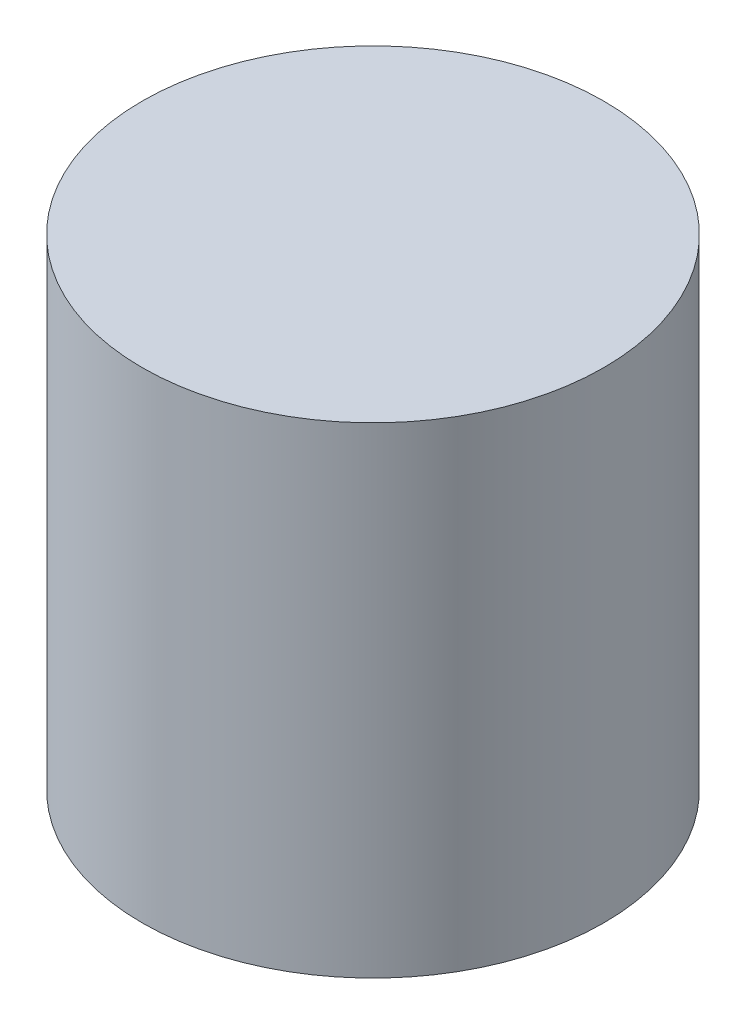
ISO-10303-21;
HEADER;
FILE_DESCRIPTION(('STEP AP214'),'2;1');
FILE_NAME('part.step','',(''),(''),'','','');
FILE_SCHEMA(('AUTOMOTIVE_DESIGN { 1 0 10303 214 1 1 1 1 }'));
ENDSEC;
DATA;
#1=APPLICATION_CONTEXT('core data for automotive mechanical design processes');
#2=APPLICATION_PROTOCOL_DEFINITION('international standard','automotive_design',2000,#1);
#3=PRODUCT_CONTEXT('',#1,'mechanical');
#4=PRODUCT('Part','Part','',(#3));
#5=PRODUCT_RELATED_PRODUCT_CATEGORY('part','',(#4));
#6=PRODUCT_DEFINITION_FORMATION('','',#4);
#7=PRODUCT_DEFINITION_CONTEXT('part definition',#1,'design');
#8=PRODUCT_DEFINITION('design','',#6,#7);
#9=PRODUCT_DEFINITION_SHAPE('','',#8);
#10=(LENGTH_UNIT() NAMED_UNIT(*) SI_UNIT(.MILLI.,.METRE.));
#11=(NAMED_UNIT(*) PLANE_ANGLE_UNIT() SI_UNIT($,.RADIAN.));
#12=(NAMED_UNIT(*) SI_UNIT($,.STERADIAN.) SOLID_ANGLE_UNIT());
#13=UNCERTAINTY_MEASURE_WITH_UNIT(LENGTH_MEASURE(1.E-05),#10,'distance_accuracy_value','');
#14=(GEOMETRIC_REPRESENTATION_CONTEXT(3) GLOBAL_UNCERTAINTY_ASSIGNED_CONTEXT((#13)) GLOBAL_UNIT_ASSIGNED_CONTEXT((#10,
#11,#12)) REPRESENTATION_CONTEXT('',''));
#15=CARTESIAN_POINT('',(0.,0.,0.));
#16=DIRECTION('',(0.,0.,1.));
#17=DIRECTION('',(1.,0.,0.));
#18=AXIS2_PLACEMENT_3D('',#15,#16,#17);
#19=CARTESIAN_POINT('',(0.,10.,0.));
#20=DIRECTION('',(0.,-1.,0.));
#21=DIRECTION('',(0.,0.,-1.));
#22=AXIS2_PLACEMENT_3D('',#19,#20,#21);
#23=CYLINDRICAL_SURFACE('',#22,4.8);
#24=CARTESIAN_POINT('',(0.,10.,0.));
#25=DIRECTION('',(0.,1.,0.));
#26=DIRECTION('',(0.,0.,1.));
#27=AXIS2_PLACEMENT_3D('',#24,#25,#26);
#28=CIRCLE('',#27,4.8);
#29=CARTESIAN_POINT('',(0.,10.,4.8));
#30=VERTEX_POINT('',#29);
#31=EDGE_CURVE('E10',#30,#30,#28,.T.);
#32=ORIENTED_EDGE('',*,*,#31,.F.);
#33=EDGE_LOOP('',(#32));
#34=FACE_BOUND('',#33,.T.);
#35=CARTESIAN_POINT('',(0.,0.,0.));
#36=DIRECTION('',(0.,1.,0.));
#37=DIRECTION('',(0.,0.,1.));
#38=AXIS2_PLACEMENT_3D('',#35,#36,#37);
#39=CIRCLE('',#38,4.8);
#40=CARTESIAN_POINT('',(0.,0.,4.8));
#41=VERTEX_POINT('',#40);
#42=EDGE_CURVE('E34',#41,#41,#39,.T.);
#43=ORIENTED_EDGE('',*,*,#42,.T.);
#44=EDGE_LOOP('',(#43));
#45=FACE_BOUND('',#44,.T.);
#46=ADVANCED_FACE('F31',(#34,#45),#23,.T.);
#47=CARTESIAN_POINT('',(0.,10.,0.));
#48=DIRECTION('',(0.,1.,0.));
#49=DIRECTION('',(0.,0.,1.));
#50=AXIS2_PLACEMENT_3D('',#47,#48,#49);
#51=PLANE('',#50);
#52=ORIENTED_EDGE('',*,*,#31,.T.);
#53=EDGE_LOOP('',(#52));
#54=FACE_BOUND('',#53,.T.);
#55=ADVANCED_FACE('F46',(#54),#51,.T.);
#56=CARTESIAN_POINT('',(0.,0.,0.));
#57=DIRECTION('',(0.,1.,0.));
#58=DIRECTION('',(0.,0.,1.));
#59=AXIS2_PLACEMENT_3D('',#56,#57,#58);
#60=PLANE('',#59);
#61=ORIENTED_EDGE('',*,*,#42,.F.);
#62=EDGE_LOOP('',(#61));
#63=FACE_BOUND('',#62,.T.);
#64=ADVANCED_FACE('F44',(#63),#60,.F.);
#65=CLOSED_SHELL('',(#46,#55,#64));
#66=MANIFOLD_SOLID_BREP('B2',#65);
#67=ADVANCED_BREP_SHAPE_REPRESENTATION('',(#18,#66),#14);
#68=SHAPE_DEFINITION_REPRESENTATION(#9,#67);
ENDSEC;
END-ISO-10303-21;
